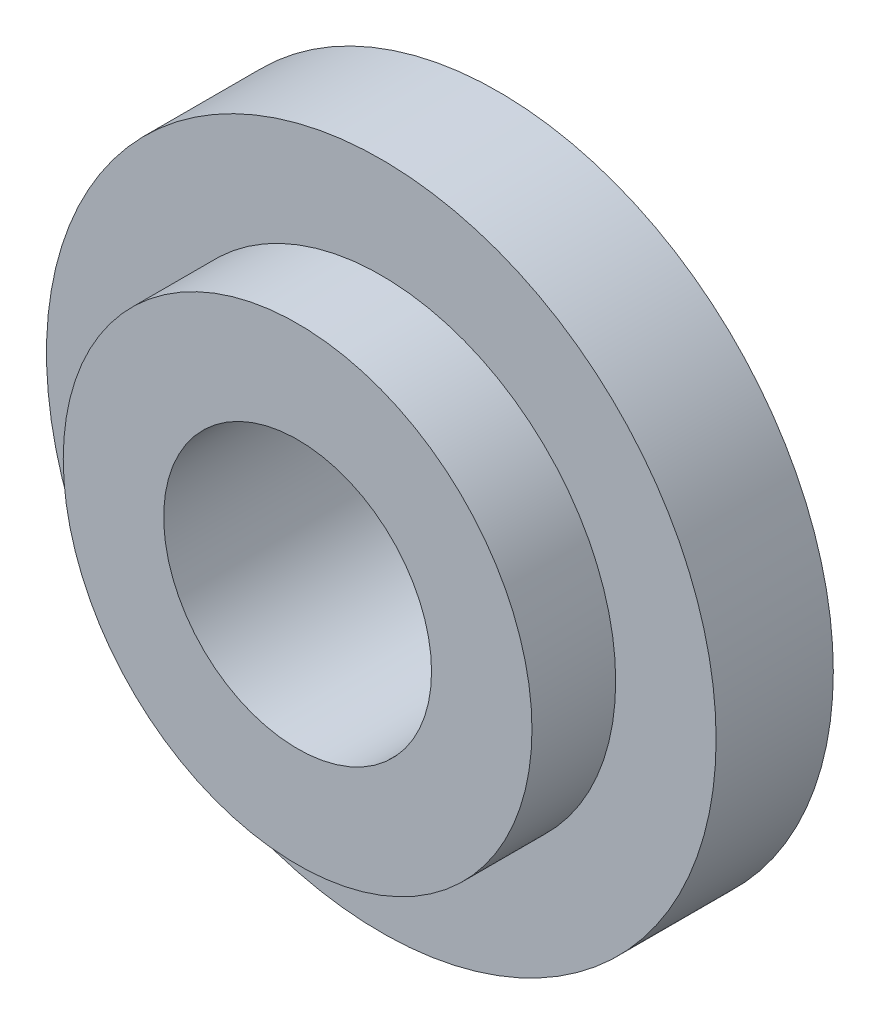
ISO-10303-21;
HEADER;
FILE_DESCRIPTION(('STEP AP214'),'2;1');
FILE_NAME('part.step','',(''),(''),'','','');
FILE_SCHEMA(('AUTOMOTIVE_DESIGN { 1 0 10303 214 1 1 1 1 }'));
ENDSEC;
DATA;
#1=APPLICATION_CONTEXT('core data for automotive mechanical design processes');
#2=APPLICATION_PROTOCOL_DEFINITION('international standard','automotive_design',2000,#1);
#3=PRODUCT_CONTEXT('',#1,'mechanical');
#4=PRODUCT('Part','Part','',(#3));
#5=PRODUCT_RELATED_PRODUCT_CATEGORY('part','',(#4));
#6=PRODUCT_DEFINITION_FORMATION('','',#4);
#7=PRODUCT_DEFINITION_CONTEXT('part definition',#1,'design');
#8=PRODUCT_DEFINITION('design','',#6,#7);
#9=PRODUCT_DEFINITION_SHAPE('','',#8);
#10=(LENGTH_UNIT() NAMED_UNIT(*) SI_UNIT(.MILLI.,.METRE.));
#11=(NAMED_UNIT(*) PLANE_ANGLE_UNIT() SI_UNIT($,.RADIAN.));
#12=(NAMED_UNIT(*) SI_UNIT($,.STERADIAN.) SOLID_ANGLE_UNIT());
#13=UNCERTAINTY_MEASURE_WITH_UNIT(LENGTH_MEASURE(1.E-05),#10,'distance_accuracy_value','');
#14=(GEOMETRIC_REPRESENTATION_CONTEXT(3) GLOBAL_UNCERTAINTY_ASSIGNED_CONTEXT((#13)) GLOBAL_UNIT_ASSIGNED_CONTEXT((#10,
#11,#12)) REPRESENTATION_CONTEXT('',''));
#15=CARTESIAN_POINT('',(0.,0.,0.));
#16=DIRECTION('',(0.,0.,1.));
#17=DIRECTION('',(1.,0.,0.));
#18=AXIS2_PLACEMENT_3D('',#15,#16,#17);
#19=CARTESIAN_POINT('',(0.,0.,3.5));
#20=DIRECTION('',(0.,0.,1.));
#21=DIRECTION('',(1.,0.,0.));
#22=AXIS2_PLACEMENT_3D('',#19,#20,#21);
#23=PLANE('',#22);
#24=CARTESIAN_POINT('',(0.,0.,3.5));
#25=DIRECTION('',(0.,0.,1.));
#26=DIRECTION('',(1.,0.,0.));
#27=AXIS2_PLACEMENT_3D('',#24,#25,#26);
#28=CIRCLE('',#27,7.);
#29=CARTESIAN_POINT('',(7.,0.,3.5));
#30=VERTEX_POINT('',#29);
#31=EDGE_CURVE('E10',#30,#30,#28,.T.);
#32=ORIENTED_EDGE('',*,*,#31,.F.);
#33=EDGE_LOOP('',(#32));
#34=FACE_BOUND('',#33,.T.);
#35=CARTESIAN_POINT('',(0.,0.,3.5));
#36=DIRECTION('',(0.,0.,1.));
#37=DIRECTION('',(1.,0.,0.));
#38=AXIS2_PLACEMENT_3D('',#35,#36,#37);
#39=CIRCLE('',#38,10.);
#40=CARTESIAN_POINT('',(10.,0.,3.5));
#41=VERTEX_POINT('',#40);
#42=EDGE_CURVE('E37',#41,#41,#39,.T.);
#43=ORIENTED_EDGE('',*,*,#42,.T.);
#44=EDGE_LOOP('',(#43));
#45=FACE_BOUND('',#44,.T.);
#46=ADVANCED_FACE('F33',(#34,#45),#23,.T.);
#47=CARTESIAN_POINT('',(0.,0.,0.));
#48=DIRECTION('',(0.,0.,1.));
#49=DIRECTION('',(1.,0.,0.));
#50=AXIS2_PLACEMENT_3D('',#47,#48,#49);
#51=PLANE('',#50);
#52=CARTESIAN_POINT('',(0.,0.,0.));
#53=DIRECTION('',(0.,0.,1.));
#54=DIRECTION('',(1.,0.,0.));
#55=AXIS2_PLACEMENT_3D('',#52,#53,#54);
#56=CIRCLE('',#55,10.);
#57=CARTESIAN_POINT('',(10.,0.,0.));
#58=VERTEX_POINT('',#57);
#59=EDGE_CURVE('E45',#58,#58,#56,.T.);
#60=ORIENTED_EDGE('',*,*,#59,.F.);
#61=EDGE_LOOP('',(#60));
#62=FACE_BOUND('',#61,.T.);
#63=CARTESIAN_POINT('',(0.,0.,0.));
#64=DIRECTION('',(0.,0.,1.));
#65=DIRECTION('',(1.,0.,0.));
#66=AXIS2_PLACEMENT_3D('',#63,#64,#65);
#67=CIRCLE('',#66,4.);
#68=CARTESIAN_POINT('',(4.,0.,0.));
#69=VERTEX_POINT('',#68);
#70=EDGE_CURVE('E52',#69,#69,#67,.T.);
#71=ORIENTED_EDGE('',*,*,#70,.T.);
#72=EDGE_LOOP('',(#71));
#73=FACE_BOUND('',#72,.T.);
#74=ADVANCED_FACE('F58',(#62,#73),#51,.F.);
#75=CARTESIAN_POINT('',(0.,0.,3.5));
#76=DIRECTION('',(0.,0.,-1.));
#77=DIRECTION('',(-1.,0.,0.));
#78=AXIS2_PLACEMENT_3D('',#75,#76,#77);
#79=CYLINDRICAL_SURFACE('',#78,10.);
#80=ORIENTED_EDGE('',*,*,#42,.F.);
#81=EDGE_LOOP('',(#80));
#82=FACE_BOUND('',#81,.T.);
#83=ORIENTED_EDGE('',*,*,#59,.T.);
#84=EDGE_LOOP('',(#83));
#85=FACE_BOUND('',#84,.T.);
#86=ADVANCED_FACE('F35',(#82,#85),#79,.T.);
#87=CARTESIAN_POINT('',(0.,0.,3.5));
#88=DIRECTION('',(0.,0.,-1.));
#89=DIRECTION('',(-1.,0.,0.));
#90=AXIS2_PLACEMENT_3D('',#87,#88,#89);
#91=CYLINDRICAL_SURFACE('',#90,4.);
#92=ORIENTED_EDGE('',*,*,#70,.F.);
#93=EDGE_LOOP('',(#92));
#94=FACE_BOUND('',#93,.T.);
#95=CARTESIAN_POINT('',(0.,0.,6.));
#96=DIRECTION('',(0.,0.,1.));
#97=DIRECTION('',(1.,0.,0.));
#98=AXIS2_PLACEMENT_3D('',#95,#96,#97);
#99=CIRCLE('',#98,4.);
#100=CARTESIAN_POINT('',(4.,0.,6.));
#101=VERTEX_POINT('',#100);
#102=EDGE_CURVE('E48',#101,#101,#99,.T.);
#103=ORIENTED_EDGE('',*,*,#102,.T.);
#104=EDGE_LOOP('',(#103));
#105=FACE_BOUND('',#104,.T.);
#106=ADVANCED_FACE('F64',(#94,#105),#91,.F.);
#107=CARTESIAN_POINT('',(0.,0.,6.));
#108=DIRECTION('',(0.,0.,1.));
#109=DIRECTION('',(1.,0.,0.));
#110=AXIS2_PLACEMENT_3D('',#107,#108,#109);
#111=PLANE('',#110);
#112=CARTESIAN_POINT('',(0.,0.,6.));
#113=DIRECTION('',(0.,0.,1.));
#114=DIRECTION('',(1.,0.,0.));
#115=AXIS2_PLACEMENT_3D('',#112,#113,#114);
#116=CIRCLE('',#115,7.);
#117=CARTESIAN_POINT('',(7.,0.,6.));
#118=VERTEX_POINT('',#117);
#119=EDGE_CURVE('E49',#118,#118,#116,.T.);
#120=ORIENTED_EDGE('',*,*,#119,.T.);
#121=EDGE_LOOP('',(#120));
#122=FACE_BOUND('',#121,.T.);
#123=ORIENTED_EDGE('',*,*,#102,.F.);
#124=EDGE_LOOP('',(#123));
#125=FACE_BOUND('',#124,.T.);
#126=ADVANCED_FACE('F67',(#122,#125),#111,.T.);
#127=CARTESIAN_POINT('',(0.,0.,6.));
#128=DIRECTION('',(0.,0.,-1.));
#129=DIRECTION('',(-1.,0.,0.));
#130=AXIS2_PLACEMENT_3D('',#127,#128,#129);
#131=CYLINDRICAL_SURFACE('',#130,7.);
#132=ORIENTED_EDGE('',*,*,#119,.F.);
#133=EDGE_LOOP('',(#132));
#134=FACE_BOUND('',#133,.T.);
#135=ORIENTED_EDGE('',*,*,#31,.T.);
#136=EDGE_LOOP('',(#135));
#137=FACE_BOUND('',#136,.T.);
#138=ADVANCED_FACE('F73',(#134,#137),#131,.T.);
#139=CLOSED_SHELL('',(#46,#74,#86,#106,#126,#138));
#140=MANIFOLD_SOLID_BREP('B2',#139);
#141=ADVANCED_BREP_SHAPE_REPRESENTATION('',(#18,#140),#14);
#142=SHAPE_DEFINITION_REPRESENTATION(#9,#141);
ENDSEC;
END-ISO-10303-21;
